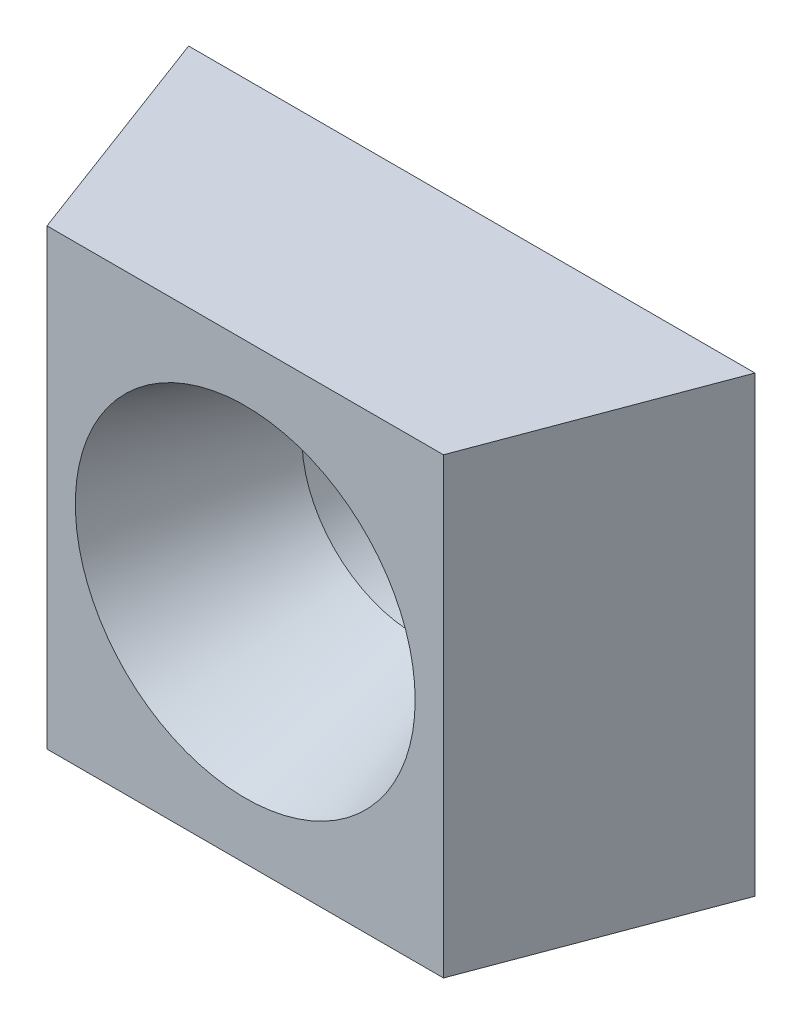
ISO-10303-21;
HEADER;
FILE_DESCRIPTION(('STEP AP214'),'2;1');
FILE_NAME('part.step','',(''),(''),'','','');
FILE_SCHEMA(('AUTOMOTIVE_DESIGN { 1 0 10303 214 1 1 1 1 }'));
ENDSEC;
DATA;
#1=APPLICATION_CONTEXT('core data for automotive mechanical design processes');
#2=APPLICATION_PROTOCOL_DEFINITION('international standard','automotive_design',2000,#1);
#3=PRODUCT_CONTEXT('',#1,'mechanical');
#4=PRODUCT('Part','Part','',(#3));
#5=PRODUCT_RELATED_PRODUCT_CATEGORY('part','',(#4));
#6=PRODUCT_DEFINITION_FORMATION('','',#4);
#7=PRODUCT_DEFINITION_CONTEXT('part definition',#1,'design');
#8=PRODUCT_DEFINITION('design','',#6,#7);
#9=PRODUCT_DEFINITION_SHAPE('','',#8);
#10=(LENGTH_UNIT() NAMED_UNIT(*) SI_UNIT(.MILLI.,.METRE.));
#11=(NAMED_UNIT(*) PLANE_ANGLE_UNIT() SI_UNIT($,.RADIAN.));
#12=(NAMED_UNIT(*) SI_UNIT($,.STERADIAN.) SOLID_ANGLE_UNIT());
#13=UNCERTAINTY_MEASURE_WITH_UNIT(LENGTH_MEASURE(1.E-05),#10,'distance_accuracy_value','');
#14=(GEOMETRIC_REPRESENTATION_CONTEXT(3) GLOBAL_UNCERTAINTY_ASSIGNED_CONTEXT((#13)) GLOBAL_UNIT_ASSIGNED_CONTEXT((#10,
#11,#12)) REPRESENTATION_CONTEXT('',''));
#15=CARTESIAN_POINT('',(0.,0.,0.));
#16=DIRECTION('',(0.,0.,1.));
#17=DIRECTION('',(1.,0.,0.));
#18=AXIS2_PLACEMENT_3D('',#15,#16,#17);
#19=CARTESIAN_POINT('',(0.,0.,0.4));
#20=DIRECTION('',(0.,0.,1.));
#21=DIRECTION('',(1.,0.,0.));
#22=AXIS2_PLACEMENT_3D('',#19,#20,#21);
#23=PLANE('',#22);
#24=CARTESIAN_POINT('',(0.,0.,0.399999999956435));
#25=DIRECTION('',(0.,0.,1.));
#26=DIRECTION('',(1.,0.,0.));
#27=AXIS2_PLACEMENT_3D('',#24,#25,#26);
#28=CIRCLE('',#27,0.299999999981537);
#29=CARTESIAN_POINT('',(0.299999999981537,0.,0.399999999956435));
#30=VERTEX_POINT('',#29);
#31=EDGE_CURVE('E20',#30,#30,#28,.F.);
#32=ORIENTED_EDGE('',*,*,#31,.T.);
#33=EDGE_LOOP('',(#32));
#34=FACE_BOUND('',#33,.T.);
#35=DIRECTION('',(1.,0.,0.));
#36=VECTOR('',#35,1.);
#37=CARTESIAN_POINT('',(0.5,-0.4,0.4));
#38=LINE('',#37,#36);
#39=CARTESIAN_POINT('',(0.35,-0.4,0.4));
#40=VERTEX_POINT('',#39);
#41=CARTESIAN_POINT('',(-0.35,-0.4,0.4));
#42=VERTEX_POINT('',#41);
#43=EDGE_CURVE('E53',#40,#42,#38,.F.);
#44=ORIENTED_EDGE('',*,*,#43,.F.);
#45=DIRECTION('',(0.,1.,0.));
#46=VECTOR('',#45,1.);
#47=CARTESIAN_POINT('',(0.35,0.4,0.4));
#48=LINE('',#47,#46);
#49=CARTESIAN_POINT('',(0.35,0.4,0.4));
#50=VERTEX_POINT('',#49);
#51=EDGE_CURVE('E62',#50,#40,#48,.F.);
#52=ORIENTED_EDGE('',*,*,#51,.F.);
#53=DIRECTION('',(1.,0.,0.));
#54=VECTOR('',#53,1.);
#55=CARTESIAN_POINT('',(-0.5,0.4,0.4));
#56=LINE('',#55,#54);
#57=CARTESIAN_POINT('',(-0.35,0.4,0.4));
#58=VERTEX_POINT('',#57);
#59=EDGE_CURVE('E58',#58,#50,#56,.T.);
#60=ORIENTED_EDGE('',*,*,#59,.F.);
#61=DIRECTION('',(0.,1.,0.));
#62=VECTOR('',#61,1.);
#63=CARTESIAN_POINT('',(-0.35,0.4,0.4));
#64=LINE('',#63,#62);
#65=EDGE_CURVE('E60',#58,#42,#64,.F.);
#66=ORIENTED_EDGE('',*,*,#65,.T.);
#67=EDGE_LOOP('',(#44,#52,#60,#66));
#68=FACE_BOUND('',#67,.T.);
#69=ADVANCED_FACE('F17',(#34,#68),#23,.T.);
#70=CARTESIAN_POINT('',(0.,0.,0.399999999956435));
#71=DIRECTION('',(0.,0.,1.));
#72=DIRECTION('',(1.,0.,0.));
#73=AXIS2_PLACEMENT_3D('',#70,#71,#72);
#74=CONICAL_SURFACE('',#73,0.299999999981537,0.321750554311377);
#75=ORIENTED_EDGE('',*,*,#31,.F.);
#76=EDGE_LOOP('',(#75));
#77=FACE_BOUND('',#76,.T.);
#78=CARTESIAN_POINT('',(0.,0.,0.1));
#79=DIRECTION('',(0.,0.,1.));
#80=DIRECTION('',(1.,0.,0.));
#81=AXIS2_PLACEMENT_3D('',#78,#79,#80);
#82=CIRCLE('',#81,0.2);
#83=CARTESIAN_POINT('',(0.2,0.,0.1));
#84=VERTEX_POINT('',#83);
#85=EDGE_CURVE('E86',#84,#84,#82,.F.);
#86=ORIENTED_EDGE('',*,*,#85,.T.);
#87=EDGE_LOOP('',(#86));
#88=FACE_BOUND('',#87,.T.);
#89=ADVANCED_FACE('F122',(#77,#88),#74,.F.);
#90=CARTESIAN_POINT('',(-0.5,0.4,0.));
#91=DIRECTION('',(0.,1.,0.));
#92=DIRECTION('',(0.,0.,1.));
#93=AXIS2_PLACEMENT_3D('',#90,#91,#92);
#94=PLANE('',#93);
#95=ORIENTED_EDGE('',*,*,#59,.T.);
#96=DIRECTION('',(0.351123441588063,0.,-0.936329177569168));
#97=VECTOR('',#96,1.);
#98=CARTESIAN_POINT('',(0.35,0.4,0.4));
#99=LINE('',#98,#97);
#100=CARTESIAN_POINT('',(0.499999999999965,0.4,0.));
#101=VERTEX_POINT('',#100);
#102=EDGE_CURVE('E82',#101,#50,#99,.F.);
#103=ORIENTED_EDGE('',*,*,#102,.F.);
#104=DIRECTION('',(1.,0.,0.));
#105=VECTOR('',#104,1.);
#106=CARTESIAN_POINT('',(0.,0.4,0.));
#107=LINE('',#106,#105);
#108=CARTESIAN_POINT('',(-0.499999999999965,0.4,0.));
#109=VERTEX_POINT('',#108);
#110=EDGE_CURVE('E77',#101,#109,#107,.F.);
#111=ORIENTED_EDGE('',*,*,#110,.T.);
#112=DIRECTION('',(-0.351123441588063,0.,-0.936329177569168));
#113=VECTOR('',#112,1.);
#114=CARTESIAN_POINT('',(-0.35,0.4,0.4));
#115=LINE('',#114,#113);
#116=EDGE_CURVE('E67',#109,#58,#115,.F.);
#117=ORIENTED_EDGE('',*,*,#116,.T.);
#118=EDGE_LOOP('',(#95,#103,#111,#117));
#119=FACE_BOUND('',#118,.T.);
#120=ADVANCED_FACE('F76',(#119),#94,.T.);
#121=CARTESIAN_POINT('',(-0.35,0.4,0.4));
#122=DIRECTION('',(0.936329177569168,0.,-0.351123441588063));
#123=DIRECTION('',(-0.351123441588063,0.,-0.936329177569168));
#124=AXIS2_PLACEMENT_3D('',#121,#122,#123);
#125=PLANE('',#124);
#126=DIRECTION('',(-0.351123441588392,0.,-0.936329177569044));
#127=VECTOR('',#126,1.);
#128=CARTESIAN_POINT('',(-0.35,-0.4,0.4));
#129=LINE('',#128,#127);
#130=CARTESIAN_POINT('',(-0.49999999999993,-0.4,0.));
#131=VERTEX_POINT('',#130);
#132=EDGE_CURVE('E73',#42,#131,#129,.T.);
#133=ORIENTED_EDGE('',*,*,#132,.F.);
#134=ORIENTED_EDGE('',*,*,#65,.F.);
#135=ORIENTED_EDGE('',*,*,#116,.F.);
#136=DIRECTION('',(0.,1.,0.));
#137=VECTOR('',#136,1.);
#138=CARTESIAN_POINT('',(-0.5,0.,0.));
#139=LINE('',#138,#137);
#140=EDGE_CURVE('E90',#109,#131,#139,.F.);
#141=ORIENTED_EDGE('',*,*,#140,.T.);
#142=EDGE_LOOP('',(#133,#134,#135,#141));
#143=FACE_BOUND('',#142,.T.);
#144=ADVANCED_FACE('F70',(#143),#125,.F.);
#145=CARTESIAN_POINT('',(0.5,-0.4,0.));
#146=DIRECTION('',(0.,-1.,0.));
#147=DIRECTION('',(0.,0.,-1.));
#148=AXIS2_PLACEMENT_3D('',#145,#146,#147);
#149=PLANE('',#148);
#150=ORIENTED_EDGE('',*,*,#43,.T.);
#151=ORIENTED_EDGE('',*,*,#132,.T.);
#152=DIRECTION('',(1.,0.,0.));
#153=VECTOR('',#152,1.);
#154=CARTESIAN_POINT('',(0.,-0.4,0.));
#155=LINE('',#154,#153);
#156=CARTESIAN_POINT('',(0.499999999999965,-0.4,0.));
#157=VERTEX_POINT('',#156);
#158=EDGE_CURVE('E92',#131,#157,#155,.T.);
#159=ORIENTED_EDGE('',*,*,#158,.T.);
#160=DIRECTION('',(0.351123441588063,0.,-0.936329177569168));
#161=VECTOR('',#160,1.);
#162=CARTESIAN_POINT('',(0.35,-0.4,0.4));
#163=LINE('',#162,#161);
#164=EDGE_CURVE('E34',#40,#157,#163,.T.);
#165=ORIENTED_EDGE('',*,*,#164,.F.);
#166=EDGE_LOOP('',(#150,#151,#159,#165));
#167=FACE_BOUND('',#166,.T.);
#168=ADVANCED_FACE('F99',(#167),#149,.T.);
#169=CARTESIAN_POINT('',(0.35,0.4,0.4));
#170=DIRECTION('',(0.936329177569168,0.,0.351123441588063));
#171=DIRECTION('',(0.351123441588063,0.,-0.936329177569168));
#172=AXIS2_PLACEMENT_3D('',#169,#170,#171);
#173=PLANE('',#172);
#174=ORIENTED_EDGE('',*,*,#164,.T.);
#175=DIRECTION('',(0.,1.,0.));
#176=VECTOR('',#175,1.);
#177=CARTESIAN_POINT('',(0.5,0.,0.));
#178=LINE('',#177,#176);
#179=EDGE_CURVE('E26',#157,#101,#178,.T.);
#180=ORIENTED_EDGE('',*,*,#179,.T.);
#181=ORIENTED_EDGE('',*,*,#102,.T.);
#182=ORIENTED_EDGE('',*,*,#51,.T.);
#183=EDGE_LOOP('',(#174,#180,#181,#182));
#184=FACE_BOUND('',#183,.T.);
#185=ADVANCED_FACE('F95',(#184),#173,.T.);
#186=CARTESIAN_POINT('',(0.,0.,0.4));
#187=DIRECTION('',(0.,0.,1.));
#188=DIRECTION('',(1.,0.,0.));
#189=AXIS2_PLACEMENT_3D('',#186,#187,#188);
#190=CYLINDRICAL_SURFACE('',#189,0.2);
#191=CARTESIAN_POINT('',(0.,0.,0.));
#192=DIRECTION('',(0.,0.,1.));
#193=DIRECTION('',(1.,0.,0.));
#194=AXIS2_PLACEMENT_3D('',#191,#192,#193);
#195=CIRCLE('',#194,0.2);
#196=CARTESIAN_POINT('',(0.2,0.,0.));
#197=VERTEX_POINT('',#196);
#198=EDGE_CURVE('E11',#197,#197,#195,.F.);
#199=ORIENTED_EDGE('',*,*,#198,.T.);
#200=EDGE_LOOP('',(#199));
#201=FACE_BOUND('',#200,.T.);
#202=ORIENTED_EDGE('',*,*,#85,.F.);
#203=EDGE_LOOP('',(#202));
#204=FACE_BOUND('',#203,.T.);
#205=ADVANCED_FACE('F107',(#201,#204),#190,.F.);
#206=CARTESIAN_POINT('',(0.,0.,0.));
#207=DIRECTION('',(0.,0.,1.));
#208=DIRECTION('',(1.,0.,0.));
#209=AXIS2_PLACEMENT_3D('',#206,#207,#208);
#210=PLANE('',#209);
#211=ORIENTED_EDGE('',*,*,#198,.F.);
#212=EDGE_LOOP('',(#211));
#213=FACE_BOUND('',#212,.T.);
#214=ORIENTED_EDGE('',*,*,#158,.F.);
#215=ORIENTED_EDGE('',*,*,#140,.F.);
#216=ORIENTED_EDGE('',*,*,#110,.F.);
#217=ORIENTED_EDGE('',*,*,#179,.F.);
#218=EDGE_LOOP('',(#214,#215,#216,#217));
#219=FACE_BOUND('',#218,.T.);
#220=ADVANCED_FACE('F98',(#213,#219),#210,.F.);
#221=CLOSED_SHELL('',(#69,#89,#120,#144,#168,#185,#205,#220));
#222=MANIFOLD_SOLID_BREP('B1',#221);
#223=ADVANCED_BREP_SHAPE_REPRESENTATION('',(#18,#222),#14);
#224=SHAPE_DEFINITION_REPRESENTATION(#9,#223);
ENDSEC;
END-ISO-10303-21;
